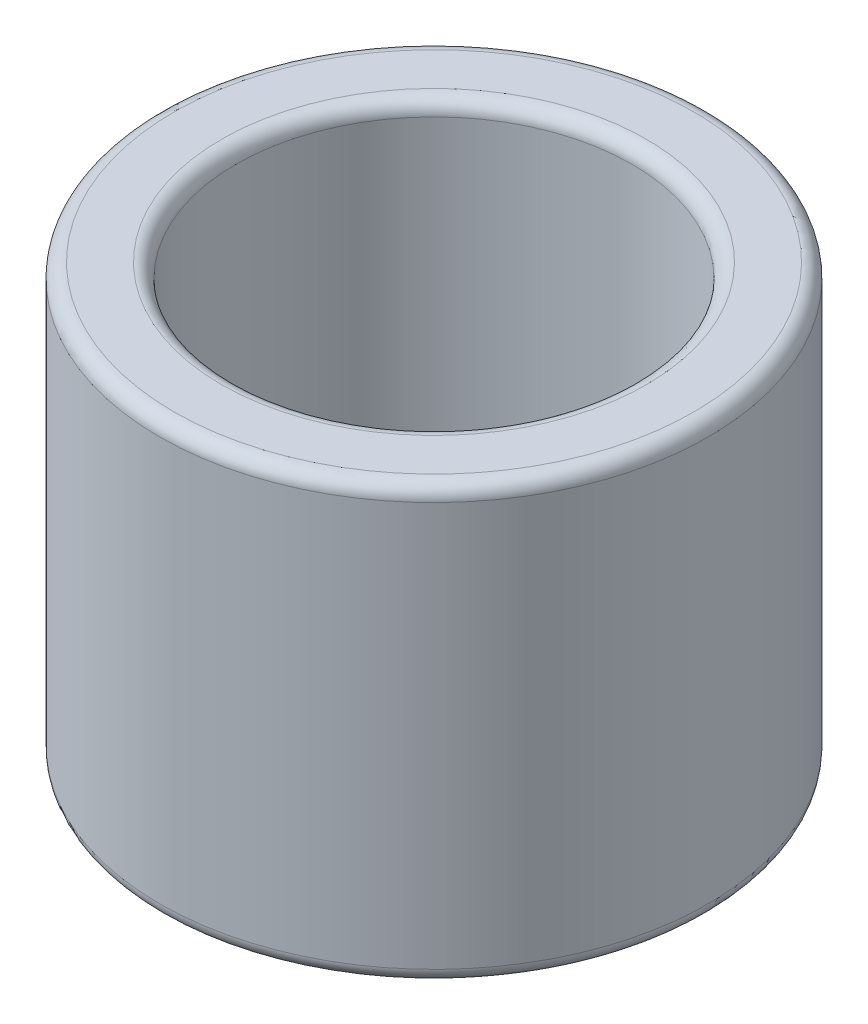
ISO-10303-21;
HEADER;
FILE_DESCRIPTION(('STEP AP214'),'2;1');
FILE_NAME('part.step','',(''),(''),'','','');
FILE_SCHEMA(('AUTOMOTIVE_DESIGN { 1 0 10303 214 1 1 1 1 }'));
ENDSEC;
DATA;
#1=APPLICATION_CONTEXT('core data for automotive mechanical design processes');
#2=APPLICATION_PROTOCOL_DEFINITION('international standard','automotive_design',2000,#1);
#3=PRODUCT_CONTEXT('',#1,'mechanical');
#4=PRODUCT('Part','Part','',(#3));
#5=PRODUCT_RELATED_PRODUCT_CATEGORY('part','',(#4));
#6=PRODUCT_DEFINITION_FORMATION('','',#4);
#7=PRODUCT_DEFINITION_CONTEXT('part definition',#1,'design');
#8=PRODUCT_DEFINITION('design','',#6,#7);
#9=PRODUCT_DEFINITION_SHAPE('','',#8);
#10=(LENGTH_UNIT() NAMED_UNIT(*) SI_UNIT(.MILLI.,.METRE.));
#11=(NAMED_UNIT(*) PLANE_ANGLE_UNIT() SI_UNIT($,.RADIAN.));
#12=(NAMED_UNIT(*) SI_UNIT($,.STERADIAN.) SOLID_ANGLE_UNIT());
#13=UNCERTAINTY_MEASURE_WITH_UNIT(LENGTH_MEASURE(1.E-05),#10,'distance_accuracy_value','');
#14=(GEOMETRIC_REPRESENTATION_CONTEXT(3) GLOBAL_UNCERTAINTY_ASSIGNED_CONTEXT((#13)) GLOBAL_UNIT_ASSIGNED_CONTEXT((#10,
#11,#12)) REPRESENTATION_CONTEXT('',''));
#15=CARTESIAN_POINT('',(0.,0.,0.));
#16=DIRECTION('',(0.,0.,1.));
#17=DIRECTION('',(1.,0.,0.));
#18=AXIS2_PLACEMENT_3D('',#15,#16,#17);
#19=CARTESIAN_POINT('',(0.,38.1,0.));
#20=DIRECTION('',(0.,-1.,0.));
#21=DIRECTION('',(0.,0.,-1.));
#22=AXIS2_PLACEMENT_3D('',#19,#20,#21);
#23=CYLINDRICAL_SURFACE('',#22,48.26);
#24=CARTESIAN_POINT('',(0.,-35.56,0.));
#25=DIRECTION('',(0.,1.,0.));
#26=DIRECTION('',(0.,0.,1.));
#27=AXIS2_PLACEMENT_3D('',#24,#25,#26);
#28=CIRCLE('',#27,48.26);
#29=CARTESIAN_POINT('',(0.,-35.56,-48.26));
#30=VERTEX_POINT('',#29);
#31=EDGE_CURVE('E61',#30,#30,#28,.T.);
#32=CARTESIAN_POINT('',(0.,35.56,0.));
#33=DIRECTION('',(0.,1.,0.));
#34=DIRECTION('',(0.,0.,1.));
#35=AXIS2_PLACEMENT_3D('',#32,#33,#34);
#36=CIRCLE('',#35,48.26);
#37=CARTESIAN_POINT('',(0.,35.56,-48.26));
#38=VERTEX_POINT('',#37);
#39=EDGE_CURVE('E65',#38,#38,#36,.F.);
#40=CARTESIAN_POINT('',(0.,-35.56,-48.26));
#41=CARTESIAN_POINT('',(0.,-34.8191666666667,-48.26));
#42=CARTESIAN_POINT('',(0.,-34.0783333333333,-48.26));
#43=CARTESIAN_POINT('',(0.,-32.5966666666667,-48.26));
#44=CARTESIAN_POINT('',(0.,-31.8558333333333,-48.26));
#45=CARTESIAN_POINT('',(0.,-30.3741666666667,-48.26));
#46=CARTESIAN_POINT('',(0.,-29.6333333333333,-48.26));
#47=CARTESIAN_POINT('',(0.,-28.1516666666667,-48.26));
#48=CARTESIAN_POINT('',(0.,-27.4108333333333,-48.26));
#49=CARTESIAN_POINT('',(0.,-25.9291666666667,-48.26));
#50=CARTESIAN_POINT('',(0.,-25.1883333333333,-48.26));
#51=CARTESIAN_POINT('',(0.,-23.7066666666667,-48.26));
#52=CARTESIAN_POINT('',(0.,-22.9658333333334,-48.26));
#53=CARTESIAN_POINT('',(0.,-21.4841666666667,-48.26));
#54=CARTESIAN_POINT('',(0.,-20.7433333333333,-48.26));
#55=CARTESIAN_POINT('',(0.,-19.2616666666667,-48.26));
#56=CARTESIAN_POINT('',(0.,-18.5208333333333,-48.26));
#57=CARTESIAN_POINT('',(0.,-17.0391666666667,-48.26));
#58=CARTESIAN_POINT('',(0.,-16.2983333333333,-48.26));
#59=CARTESIAN_POINT('',(0.,-14.8166666666667,-48.26));
#60=CARTESIAN_POINT('',(0.,-14.0758333333333,-48.26));
#61=CARTESIAN_POINT('',(0.,-12.5941666666667,-48.26));
#62=CARTESIAN_POINT('',(0.,-11.8533333333333,-48.26));
#63=CARTESIAN_POINT('',(0.,-10.3716666666667,-48.26));
#64=CARTESIAN_POINT('',(0.,-9.63083333333334,-48.26));
#65=CARTESIAN_POINT('',(0.,-8.14916666666667,-48.26));
#66=CARTESIAN_POINT('',(0.,-7.40833333333334,-48.26));
#67=CARTESIAN_POINT('',(0.,-5.92666666666667,-48.26));
#68=CARTESIAN_POINT('',(0.,-5.18583333333334,-48.26));
#69=CARTESIAN_POINT('',(0.,-3.70416666666667,-48.26));
#70=CARTESIAN_POINT('',(0.,-2.96333333333334,-48.26));
#71=CARTESIAN_POINT('',(0.,-1.48166666666667,-48.26));
#72=CARTESIAN_POINT('',(0.,-0.740833333333341,-48.26));
#73=CARTESIAN_POINT('',(0.,0.740833333333327,-48.26));
#74=CARTESIAN_POINT('',(0.,1.48166666666666,-48.26));
#75=CARTESIAN_POINT('',(0.,2.96333333333333,-48.26));
#76=CARTESIAN_POINT('',(0.,3.70416666666666,-48.26));
#77=CARTESIAN_POINT('',(0.,5.18583333333333,-48.26));
#78=CARTESIAN_POINT('',(0.,5.92666666666666,-48.26));
#79=CARTESIAN_POINT('',(0.,7.40833333333333,-48.26));
#80=CARTESIAN_POINT('',(0.,8.14916666666666,-48.26));
#81=CARTESIAN_POINT('',(0.,9.63083333333333,-48.26));
#82=CARTESIAN_POINT('',(0.,10.3716666666667,-48.26));
#83=CARTESIAN_POINT('',(0.,11.8533333333333,-48.26));
#84=CARTESIAN_POINT('',(0.,12.5941666666667,-48.26));
#85=CARTESIAN_POINT('',(0.,14.0758333333333,-48.26));
#86=CARTESIAN_POINT('',(0.,14.8166666666667,-48.26));
#87=CARTESIAN_POINT('',(0.,16.2983333333333,-48.26));
#88=CARTESIAN_POINT('',(0.,17.0391666666667,-48.26));
#89=CARTESIAN_POINT('',(0.,18.5208333333333,-48.26));
#90=CARTESIAN_POINT('',(0.,19.2616666666667,-48.26));
#91=CARTESIAN_POINT('',(0.,20.7433333333333,-48.26));
#92=CARTESIAN_POINT('',(0.,21.4841666666667,-48.26));
#93=CARTESIAN_POINT('',(0.,22.9658333333333,-48.26));
#94=CARTESIAN_POINT('',(0.,23.7066666666667,-48.26));
#95=CARTESIAN_POINT('',(0.,25.1883333333333,-48.26));
#96=CARTESIAN_POINT('',(0.,25.9291666666667,-48.26));
#97=CARTESIAN_POINT('',(0.,27.4108333333333,-48.26));
#98=CARTESIAN_POINT('',(0.,28.1516666666667,-48.26));
#99=CARTESIAN_POINT('',(0.,29.6333333333333,-48.26));
#100=CARTESIAN_POINT('',(0.,30.3741666666667,-48.26));
#101=CARTESIAN_POINT('',(0.,31.8558333333333,-48.26));
#102=CARTESIAN_POINT('',(0.,32.5966666666667,-48.26));
#103=CARTESIAN_POINT('',(0.,34.0783333333333,-48.26));
#104=CARTESIAN_POINT('',(0.,34.8191666666667,-48.26));
#105=CARTESIAN_POINT('',(0.,35.56,-48.26));
#106=B_SPLINE_CURVE_WITH_KNOTS('',3,(#40,#41,#42,#43,#44,#45,#46,#47,#48,#49,#50,#51,#52,#53,
#54,#55,#56,#57,#58,#59,#60,#61,#62,#63,#64,#65,#66,#67,#68,#69,#70,#71,#72,#73,#74,#75,#76,#77,
#78,#79,#80,#81,#82,#83,#84,#85,#86,#87,#88,#89,#90,#91,#92,#93,#94,#95,#96,#97,#98,#99,#100,
#101,#102,#103,#104,#105),.UNSPECIFIED.,.F.,.F.,(4,2,2,2,2,2,2,2,2,2,2,2,2,2,2,2,2,2,2,2,2,2,2,
2,2,2,2,2,2,2,2,2,4),(0.,2.2225,4.445,6.66750000000001,8.89000000000001,11.1125,13.335,15.5575,
17.78,20.0025,22.225,24.4475,26.67,28.8925,31.115,33.3375,35.56,37.7825,40.005,42.2275,44.45,
46.6725,48.895,51.1175,53.34,55.5625,57.785,60.0075,62.23,64.4525,66.675,68.8975,71.12),.UNSPECIFIED.);
#107=EDGE_CURVE('BSEAM37',#30,#38,#106,.T.);
#108=ORIENTED_EDGE('',*,*,#31,.T.);
#109=ORIENTED_EDGE('',*,*,#39,.T.);
#110=ORIENTED_EDGE('',*,*,#107,.T.);
#111=ORIENTED_EDGE('',*,*,#107,.F.);
#112=EDGE_LOOP('',(#108,#110,#109,#111));
#113=FACE_BOUND('',#112,.T.);
#114=ADVANCED_FACE('F37',(#113),#23,.T.);
#115=CARTESIAN_POINT('',(0.,38.1,0.));
#116=DIRECTION('',(0.,1.,0.));
#117=DIRECTION('',(0.,0.,1.));
#118=AXIS2_PLACEMENT_3D('',#115,#116,#117);
#119=PLANE('',#118);
#120=CARTESIAN_POINT('',(0.,38.1,0.));
#121=DIRECTION('',(0.,1.,0.));
#122=DIRECTION('',(0.,0.,1.));
#123=AXIS2_PLACEMENT_3D('',#120,#121,#122);
#124=CIRCLE('',#123,45.72);
#125=CARTESIAN_POINT('',(0.,38.1,45.72));
#126=VERTEX_POINT('',#125);
#127=EDGE_CURVE('E45',#126,#126,#124,.T.);
#128=ORIENTED_EDGE('',*,*,#127,.T.);
#129=EDGE_LOOP('',(#128));
#130=FACE_BOUND('',#129,.T.);
#131=CARTESIAN_POINT('',(0.,38.1,0.));
#132=DIRECTION('',(0.,1.,0.));
#133=DIRECTION('',(0.,0.,1.));
#134=AXIS2_PLACEMENT_3D('',#131,#132,#133);
#135=CIRCLE('',#134,37.3843726051515);
#136=CARTESIAN_POINT('',(0.,38.1,37.3843726051515));
#137=VERTEX_POINT('',#136);
#138=EDGE_CURVE('E50',#137,#137,#135,.F.);
#139=ORIENTED_EDGE('',*,*,#138,.T.);
#140=EDGE_LOOP('',(#139));
#141=FACE_BOUND('',#140,.T.);
#142=ADVANCED_FACE('F86',(#130,#141),#119,.T.);
#143=CARTESIAN_POINT('',(0.,-38.1,0.));
#144=DIRECTION('',(0.,1.,0.));
#145=DIRECTION('',(0.,0.,1.));
#146=AXIS2_PLACEMENT_3D('',#143,#144,#145);
#147=PLANE('',#146);
#148=CARTESIAN_POINT('',(0.,-38.1,0.));
#149=DIRECTION('',(0.,1.,0.));
#150=DIRECTION('',(0.,0.,1.));
#151=AXIS2_PLACEMENT_3D('',#148,#149,#150);
#152=CIRCLE('',#151,45.72);
#153=CARTESIAN_POINT('',(0.,-38.1,45.72));
#154=VERTEX_POINT('',#153);
#155=EDGE_CURVE('E55',#154,#154,#152,.F.);
#156=ORIENTED_EDGE('',*,*,#155,.T.);
#157=EDGE_LOOP('',(#156));
#158=FACE_BOUND('',#157,.T.);
#159=ADVANCED_FACE('F78',(#158),#147,.F.);
#160=CARTESIAN_POINT('',(0.,-12.7,0.));
#161=DIRECTION('',(0.,1.,0.));
#162=DIRECTION('',(0.,0.,1.));
#163=AXIS2_PLACEMENT_3D('',#160,#161,#162);
#164=CYLINDRICAL_SURFACE('',#163,34.8443726051515);
#165=CARTESIAN_POINT('',(0.,35.56,0.));
#166=DIRECTION('',(0.,1.,0.));
#167=DIRECTION('',(0.,0.,1.));
#168=AXIS2_PLACEMENT_3D('',#165,#166,#167);
#169=CIRCLE('',#168,34.8443726051515);
#170=CARTESIAN_POINT('',(0.,35.56,34.8443726051515));
#171=VERTEX_POINT('',#170);
#172=EDGE_CURVE('E10',#171,#171,#169,.T.);
#173=ORIENTED_EDGE('',*,*,#172,.T.);
#174=EDGE_LOOP('',(#173));
#175=FACE_BOUND('',#174,.T.);
#176=CARTESIAN_POINT('',(0.,-12.7,0.));
#177=DIRECTION('',(0.,1.,0.));
#178=DIRECTION('',(0.,0.,1.));
#179=AXIS2_PLACEMENT_3D('',#176,#177,#178);
#180=CIRCLE('',#179,34.8443726051515);
#181=CARTESIAN_POINT('',(0.,-12.7,34.8443726051515));
#182=VERTEX_POINT('',#181);
#183=EDGE_CURVE('E69',#182,#182,#180,.T.);
#184=ORIENTED_EDGE('',*,*,#183,.F.);
#185=EDGE_LOOP('',(#184));
#186=FACE_BOUND('',#185,.T.);
#187=ADVANCED_FACE('F76',(#175,#186),#164,.F.);
#188=CARTESIAN_POINT('',(0.,-12.7,0.));
#189=DIRECTION('',(0.,1.,0.));
#190=DIRECTION('',(0.,0.,1.));
#191=AXIS2_PLACEMENT_3D('',#188,#189,#190);
#192=PLANE('',#191);
#193=ORIENTED_EDGE('',*,*,#183,.T.);
#194=EDGE_LOOP('',(#193));
#195=FACE_BOUND('',#194,.T.);
#196=ADVANCED_FACE('F74',(#195),#192,.T.);
#197=CARTESIAN_POINT('',(0.,-35.56,0.));
#198=DIRECTION('',(0.,1.,0.));
#199=DIRECTION('',(0.,0.,1.));
#200=AXIS2_PLACEMENT_3D('',#197,#198,#199);
#201=TOROIDAL_SURFACE('',#200,45.72,2.54);
#202=ORIENTED_EDGE('',*,*,#155,.F.);
#203=EDGE_LOOP('',(#202));
#204=FACE_BOUND('',#203,.T.);
#205=ORIENTED_EDGE('',*,*,#31,.F.);
#206=EDGE_LOOP('',(#205));
#207=FACE_BOUND('',#206,.T.);
#208=ADVANCED_FACE('F84',(#204,#207),#201,.T.);
#209=CARTESIAN_POINT('',(0.,35.56,0.));
#210=DIRECTION('',(0.,1.,0.));
#211=DIRECTION('',(0.,0.,1.));
#212=AXIS2_PLACEMENT_3D('',#209,#210,#211);
#213=TOROIDAL_SURFACE('',#212,45.72,2.54);
#214=ORIENTED_EDGE('',*,*,#39,.F.);
#215=EDGE_LOOP('',(#214));
#216=FACE_BOUND('',#215,.T.);
#217=ORIENTED_EDGE('',*,*,#127,.F.);
#218=EDGE_LOOP('',(#217));
#219=FACE_BOUND('',#218,.T.);
#220=ADVANCED_FACE('F99',(#216,#219),#213,.T.);
#221=CARTESIAN_POINT('',(0.,35.56,0.));
#222=DIRECTION('',(0.,1.,0.));
#223=DIRECTION('',(0.,0.,1.));
#224=AXIS2_PLACEMENT_3D('',#221,#222,#223);
#225=TOROIDAL_SURFACE('',#224,37.3843726051515,2.54);
#226=ORIENTED_EDGE('',*,*,#138,.F.);
#227=EDGE_LOOP('',(#226));
#228=FACE_BOUND('',#227,.T.);
#229=ORIENTED_EDGE('',*,*,#172,.F.);
#230=EDGE_LOOP('',(#229));
#231=FACE_BOUND('',#230,.T.);
#232=ADVANCED_FACE('F39',(#228,#231),#225,.T.);
#233=CLOSED_SHELL('',(#114,#142,#159,#187,#196,#208,#220,#232));
#234=MANIFOLD_SOLID_BREP('B2',#233);
#235=ADVANCED_BREP_SHAPE_REPRESENTATION('',(#18,#234),#14);
#236=SHAPE_DEFINITION_REPRESENTATION(#9,#235);
ENDSEC;
END-ISO-10303-21;
